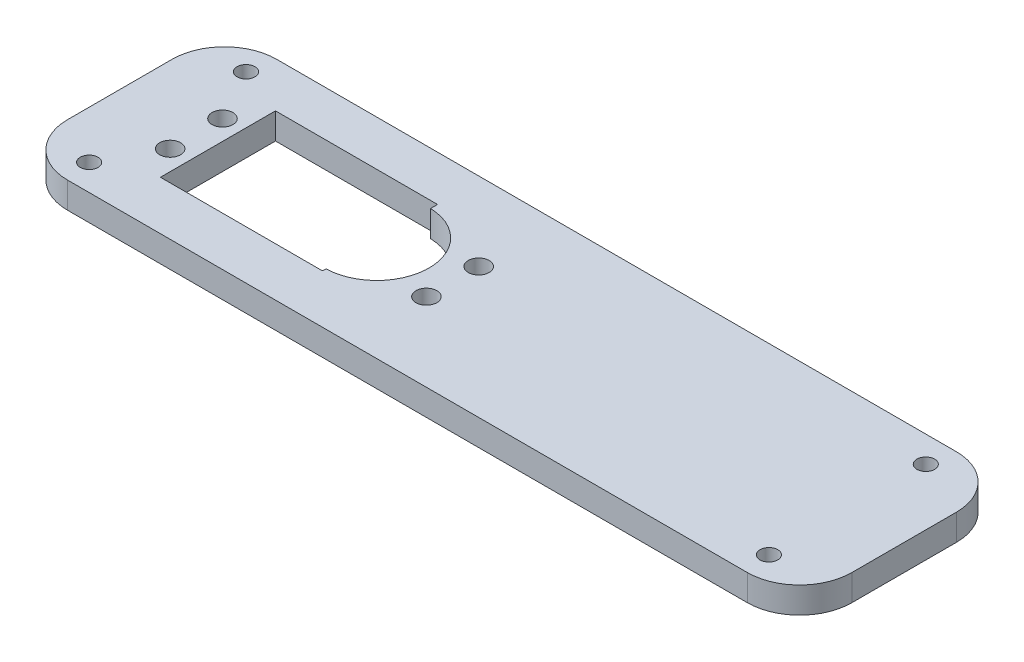
ISO-10303-21;
HEADER;
FILE_DESCRIPTION(('STEP AP214'),'2;1');
FILE_NAME('part.step','',(''),(''),'','','');
FILE_SCHEMA(('AUTOMOTIVE_DESIGN { 1 0 10303 214 1 1 1 1 }'));
ENDSEC;
DATA;
#1=APPLICATION_CONTEXT('core data for automotive mechanical design processes');
#2=APPLICATION_PROTOCOL_DEFINITION('international standard','automotive_design',2000,#1);
#3=PRODUCT_CONTEXT('',#1,'mechanical');
#4=PRODUCT('Part','Part','',(#3));
#5=PRODUCT_RELATED_PRODUCT_CATEGORY('part','',(#4));
#6=PRODUCT_DEFINITION_FORMATION('','',#4);
#7=PRODUCT_DEFINITION_CONTEXT('part definition',#1,'design');
#8=PRODUCT_DEFINITION('design','',#6,#7);
#9=PRODUCT_DEFINITION_SHAPE('','',#8);
#10=(LENGTH_UNIT() NAMED_UNIT(*) SI_UNIT(.MILLI.,.METRE.));
#11=(NAMED_UNIT(*) PLANE_ANGLE_UNIT() SI_UNIT($,.RADIAN.));
#12=(NAMED_UNIT(*) SI_UNIT($,.STERADIAN.) SOLID_ANGLE_UNIT());
#13=UNCERTAINTY_MEASURE_WITH_UNIT(LENGTH_MEASURE(1.E-05),#10,'distance_accuracy_value','');
#14=(GEOMETRIC_REPRESENTATION_CONTEXT(3) GLOBAL_UNCERTAINTY_ASSIGNED_CONTEXT((#13)) GLOBAL_UNIT_ASSIGNED_CONTEXT((#10,
#11,#12)) REPRESENTATION_CONTEXT('',''));
#15=CARTESIAN_POINT('',(0.,0.,0.));
#16=DIRECTION('',(0.,0.,1.));
#17=DIRECTION('',(1.,0.,0.));
#18=AXIS2_PLACEMENT_3D('',#15,#16,#17);
#19=CARTESIAN_POINT('',(100.867654831489,5.,-20.));
#20=DIRECTION('',(-1.,0.,0.));
#21=DIRECTION('',(0.,0.,1.));
#22=AXIS2_PLACEMENT_3D('',#19,#20,#21);
#23=PLANE('',#22);
#24=DIRECTION('',(0.,0.,-1.));
#25=VECTOR('',#24,1.);
#26=CARTESIAN_POINT('',(100.867654831489,5.,-20.));
#27=LINE('',#26,#25);
#28=CARTESIAN_POINT('',(100.867654831489,5.,9.99999999999999));
#29=VERTEX_POINT('',#28);
#30=CARTESIAN_POINT('',(100.867654831489,5.,-10.));
#31=VERTEX_POINT('',#30);
#32=EDGE_CURVE('E195',#29,#31,#27,.T.);
#33=ORIENTED_EDGE('',*,*,#32,.F.);
#34=DIRECTION('',(0.,-1.,0.));
#35=VECTOR('',#34,1.);
#36=CARTESIAN_POINT('',(100.867654831489,5.,9.99999999999999));
#37=LINE('',#36,#35);
#38=CARTESIAN_POINT('',(100.867654831489,0.,9.99999999999999));
#39=VERTEX_POINT('',#38);
#40=EDGE_CURVE('E217',#29,#39,#37,.T.);
#41=ORIENTED_EDGE('',*,*,#40,.T.);
#42=DIRECTION('',(0.,0.,-1.));
#43=VECTOR('',#42,1.);
#44=CARTESIAN_POINT('',(100.867654831489,0.,-20.));
#45=LINE('',#44,#43);
#46=CARTESIAN_POINT('',(100.867654831489,0.,-10.));
#47=VERTEX_POINT('',#46);
#48=EDGE_CURVE('E187',#39,#47,#45,.T.);
#49=ORIENTED_EDGE('',*,*,#48,.T.);
#50=DIRECTION('',(0.,-1.,0.));
#51=VECTOR('',#50,1.);
#52=CARTESIAN_POINT('',(100.867654831489,5.,-10.));
#53=LINE('',#52,#51);
#54=EDGE_CURVE('E206',#47,#31,#53,.F.);
#55=ORIENTED_EDGE('',*,*,#54,.T.);
#56=EDGE_LOOP('',(#33,#41,#49,#55));
#57=FACE_BOUND('',#56,.T.);
#58=ADVANCED_FACE('F33',(#57),#23,.F.);
#59=CARTESIAN_POINT('',(-49.1323451685113,5.,-20.));
#60=DIRECTION('',(0.,0.,1.));
#61=DIRECTION('',(1.,0.,0.));
#62=AXIS2_PLACEMENT_3D('',#59,#60,#61);
#63=PLANE('',#62);
#64=DIRECTION('',(-1.,0.,0.));
#65=VECTOR('',#64,1.);
#66=CARTESIAN_POINT('',(-49.1323451685113,0.,-20.));
#67=LINE('',#66,#65);
#68=CARTESIAN_POINT('',(90.8676548314887,0.,-20.));
#69=VERTEX_POINT('',#68);
#70=CARTESIAN_POINT('',(-39.1323451685113,0.,-20.));
#71=VERTEX_POINT('',#70);
#72=EDGE_CURVE('E209',#69,#71,#67,.T.);
#73=ORIENTED_EDGE('',*,*,#72,.T.);
#74=DIRECTION('',(0.,-1.,0.));
#75=VECTOR('',#74,1.);
#76=CARTESIAN_POINT('',(-39.1323451685113,5.,-20.));
#77=LINE('',#76,#75);
#78=CARTESIAN_POINT('',(-39.1323451685113,5.,-20.));
#79=VERTEX_POINT('',#78);
#80=EDGE_CURVE('E11',#71,#79,#77,.F.);
#81=ORIENTED_EDGE('',*,*,#80,.T.);
#82=DIRECTION('',(-1.,0.,0.));
#83=VECTOR('',#82,1.);
#84=CARTESIAN_POINT('',(-49.1323451685113,5.,-20.));
#85=LINE('',#84,#83);
#86=CARTESIAN_POINT('',(90.8676548314887,5.,-20.));
#87=VERTEX_POINT('',#86);
#88=EDGE_CURVE('E198',#87,#79,#85,.T.);
#89=ORIENTED_EDGE('',*,*,#88,.F.);
#90=DIRECTION('',(0.,-1.,0.));
#91=VECTOR('',#90,1.);
#92=CARTESIAN_POINT('',(90.8676548314887,5.,-20.));
#93=LINE('',#92,#91);
#94=EDGE_CURVE('E41',#87,#69,#93,.T.);
#95=ORIENTED_EDGE('',*,*,#94,.T.);
#96=EDGE_LOOP('',(#73,#81,#89,#95));
#97=FACE_BOUND('',#96,.T.);
#98=ADVANCED_FACE('F248',(#97),#63,.F.);
#99=CARTESIAN_POINT('',(-49.1323451685113,5.,-20.));
#100=DIRECTION('',(1.,0.,0.));
#101=DIRECTION('',(0.,0.,-1.));
#102=AXIS2_PLACEMENT_3D('',#99,#100,#101);
#103=PLANE('',#102);
#104=DIRECTION('',(0.,0.,1.));
#105=VECTOR('',#104,1.);
#106=CARTESIAN_POINT('',(-49.1323451685113,0.,-20.));
#107=LINE('',#106,#105);
#108=CARTESIAN_POINT('',(-49.1323451685113,0.,-10.));
#109=VERTEX_POINT('',#108);
#110=CARTESIAN_POINT('',(-49.1323451685113,0.,10.));
#111=VERTEX_POINT('',#110);
#112=EDGE_CURVE('E212',#109,#111,#107,.T.);
#113=ORIENTED_EDGE('',*,*,#112,.T.);
#114=DIRECTION('',(0.,-1.,0.));
#115=VECTOR('',#114,1.);
#116=CARTESIAN_POINT('',(-49.1323451685113,5.,10.));
#117=LINE('',#116,#115);
#118=CARTESIAN_POINT('',(-49.1323451685113,5.,10.));
#119=VERTEX_POINT('',#118);
#120=EDGE_CURVE('E48',#111,#119,#117,.F.);
#121=ORIENTED_EDGE('',*,*,#120,.T.);
#122=DIRECTION('',(0.,0.,1.));
#123=VECTOR('',#122,1.);
#124=CARTESIAN_POINT('',(-49.1323451685113,5.,-20.));
#125=LINE('',#124,#123);
#126=CARTESIAN_POINT('',(-49.1323451685113,5.,-10.));
#127=VERTEX_POINT('',#126);
#128=EDGE_CURVE('E201',#127,#119,#125,.T.);
#129=ORIENTED_EDGE('',*,*,#128,.F.);
#130=DIRECTION('',(0.,-1.,0.));
#131=VECTOR('',#130,1.);
#132=CARTESIAN_POINT('',(-49.1323451685113,5.,-10.));
#133=LINE('',#132,#131);
#134=EDGE_CURVE('E240',#127,#109,#133,.T.);
#135=ORIENTED_EDGE('',*,*,#134,.T.);
#136=EDGE_LOOP('',(#113,#121,#129,#135));
#137=FACE_BOUND('',#136,.T.);
#138=ADVANCED_FACE('F257',(#137),#103,.F.);
#139=CARTESIAN_POINT('',(-49.1323451685113,5.,20.));
#140=DIRECTION('',(0.,0.,-1.));
#141=DIRECTION('',(-1.,0.,0.));
#142=AXIS2_PLACEMENT_3D('',#139,#140,#141);
#143=PLANE('',#142);
#144=DIRECTION('',(1.,0.,0.));
#145=VECTOR('',#144,1.);
#146=CARTESIAN_POINT('',(-49.1323451685113,0.,20.));
#147=LINE('',#146,#145);
#148=CARTESIAN_POINT('',(-39.1323451685113,0.,20.));
#149=VERTEX_POINT('',#148);
#150=CARTESIAN_POINT('',(90.8676548314887,0.,20.));
#151=VERTEX_POINT('',#150);
#152=EDGE_CURVE('E199',#149,#151,#147,.T.);
#153=ORIENTED_EDGE('',*,*,#152,.T.);
#154=DIRECTION('',(0.,-1.,0.));
#155=VECTOR('',#154,1.);
#156=CARTESIAN_POINT('',(90.8676548314887,5.,20.));
#157=LINE('',#156,#155);
#158=CARTESIAN_POINT('',(90.8676548314887,5.,20.));
#159=VERTEX_POINT('',#158);
#160=EDGE_CURVE('E231',#151,#159,#157,.F.);
#161=ORIENTED_EDGE('',*,*,#160,.T.);
#162=DIRECTION('',(1.,0.,0.));
#163=VECTOR('',#162,1.);
#164=CARTESIAN_POINT('',(-49.1323451685113,5.,20.));
#165=LINE('',#164,#163);
#166=CARTESIAN_POINT('',(-39.1323451685113,5.,20.));
#167=VERTEX_POINT('',#166);
#168=EDGE_CURVE('E203',#167,#159,#165,.T.);
#169=ORIENTED_EDGE('',*,*,#168,.F.);
#170=DIRECTION('',(0.,-1.,0.));
#171=VECTOR('',#170,1.);
#172=CARTESIAN_POINT('',(-39.1323451685113,5.,20.));
#173=LINE('',#172,#171);
#174=EDGE_CURVE('E228',#167,#149,#173,.T.);
#175=ORIENTED_EDGE('',*,*,#174,.T.);
#176=EDGE_LOOP('',(#153,#161,#169,#175));
#177=FACE_BOUND('',#176,.T.);
#178=ADVANCED_FACE('F266',(#177),#143,.F.);
#179=CARTESIAN_POINT('',(0.,5.,0.));
#180=DIRECTION('',(0.,1.,0.));
#181=DIRECTION('',(0.,0.,1.));
#182=AXIS2_PLACEMENT_3D('',#179,#180,#181);
#183=PLANE('',#182);
#184=CARTESIAN_POINT('',(-40.,5.,15.));
#185=DIRECTION('',(0.,1.,0.));
#186=DIRECTION('',(0.,0.,1.));
#187=AXIS2_PLACEMENT_3D('',#184,#185,#186);
#188=CIRCLE('',#187,1.7);
#189=CARTESIAN_POINT('',(-40.,5.,16.7));
#190=VERTEX_POINT('',#189);
#191=EDGE_CURVE('E493',#190,#190,#188,.T.);
#192=ORIENTED_EDGE('',*,*,#191,.F.);
#193=EDGE_LOOP('',(#192));
#194=FACE_BOUND('',#193,.T.);
#195=CARTESIAN_POINT('',(90.,5.,15.));
#196=DIRECTION('',(0.,1.,0.));
#197=DIRECTION('',(0.,0.,1.));
#198=AXIS2_PLACEMENT_3D('',#195,#196,#197);
#199=CIRCLE('',#198,1.7);
#200=CARTESIAN_POINT('',(90.,5.,16.7));
#201=VERTEX_POINT('',#200);
#202=EDGE_CURVE('E497',#201,#201,#199,.T.);
#203=ORIENTED_EDGE('',*,*,#202,.F.);
#204=EDGE_LOOP('',(#203));
#205=FACE_BOUND('',#204,.T.);
#206=CARTESIAN_POINT('',(90.,5.,-15.));
#207=DIRECTION('',(0.,1.,0.));
#208=DIRECTION('',(0.,0.,1.));
#209=AXIS2_PLACEMENT_3D('',#206,#207,#208);
#210=CIRCLE('',#209,1.7);
#211=CARTESIAN_POINT('',(90.,5.,-13.3));
#212=VERTEX_POINT('',#211);
#213=EDGE_CURVE('E501',#212,#212,#210,.T.);
#214=ORIENTED_EDGE('',*,*,#213,.F.);
#215=EDGE_LOOP('',(#214));
#216=FACE_BOUND('',#215,.T.);
#217=CARTESIAN_POINT('',(-40.,5.,-15.));
#218=DIRECTION('',(0.,1.,0.));
#219=DIRECTION('',(0.,0.,1.));
#220=AXIS2_PLACEMENT_3D('',#217,#218,#219);
#221=CIRCLE('',#220,1.7);
#222=CARTESIAN_POINT('',(-40.,5.,-13.3));
#223=VERTEX_POINT('',#222);
#224=EDGE_CURVE('E505',#223,#223,#221,.T.);
#225=ORIENTED_EDGE('',*,*,#224,.F.);
#226=EDGE_LOOP('',(#225));
#227=FACE_BOUND('',#226,.T.);
#228=CARTESIAN_POINT('',(-34.5,5.,5.));
#229=DIRECTION('',(0.,1.,0.));
#230=DIRECTION('',(0.,0.,1.));
#231=AXIS2_PLACEMENT_3D('',#228,#229,#230);
#232=CIRCLE('',#231,2.);
#233=CARTESIAN_POINT('',(-34.5,5.,7.));
#234=VERTEX_POINT('',#233);
#235=EDGE_CURVE('E509',#234,#234,#232,.T.);
#236=ORIENTED_EDGE('',*,*,#235,.F.);
#237=EDGE_LOOP('',(#236));
#238=FACE_BOUND('',#237,.T.);
#239=CARTESIAN_POINT('',(-34.5,5.,-5.));
#240=DIRECTION('',(0.,1.,0.));
#241=DIRECTION('',(0.,0.,1.));
#242=AXIS2_PLACEMENT_3D('',#239,#240,#241);
#243=CIRCLE('',#242,2.);
#244=CARTESIAN_POINT('',(-34.5,5.,-2.99999999999999));
#245=VERTEX_POINT('',#244);
#246=EDGE_CURVE('E513',#245,#245,#243,.T.);
#247=ORIENTED_EDGE('',*,*,#246,.F.);
#248=EDGE_LOOP('',(#247));
#249=FACE_BOUND('',#248,.T.);
#250=CARTESIAN_POINT('',(14.5,5.,5.));
#251=DIRECTION('',(0.,1.,0.));
#252=DIRECTION('',(0.,0.,1.));
#253=AXIS2_PLACEMENT_3D('',#250,#251,#252);
#254=CIRCLE('',#253,2.);
#255=CARTESIAN_POINT('',(14.5,5.,7.));
#256=VERTEX_POINT('',#255);
#257=EDGE_CURVE('E517',#256,#256,#254,.T.);
#258=ORIENTED_EDGE('',*,*,#257,.F.);
#259=EDGE_LOOP('',(#258));
#260=FACE_BOUND('',#259,.T.);
#261=CARTESIAN_POINT('',(14.5,5.,-5.));
#262=DIRECTION('',(0.,1.,0.));
#263=DIRECTION('',(0.,0.,1.));
#264=AXIS2_PLACEMENT_3D('',#261,#262,#263);
#265=CIRCLE('',#264,2.00000000000001);
#266=CARTESIAN_POINT('',(14.5,5.,-2.99999999999998));
#267=VERTEX_POINT('',#266);
#268=EDGE_CURVE('E177',#267,#267,#265,.T.);
#269=ORIENTED_EDGE('',*,*,#268,.F.);
#270=EDGE_LOOP('',(#269));
#271=FACE_BOUND('',#270,.T.);
#272=DIRECTION('',(0.,0.,-1.));
#273=VECTOR('',#272,1.);
#274=CARTESIAN_POINT('',(0.292318991445043,5.,0.));
#275=LINE('',#274,#273);
#276=CARTESIAN_POINT('',(0.292318991445044,5.,10.6610389955653));
#277=VERTEX_POINT('',#276);
#278=CARTESIAN_POINT('',(0.292318991445044,5.,9.99572656725066));
#279=VERTEX_POINT('',#278);
#280=EDGE_CURVE('E142',#277,#279,#275,.T.);
#281=ORIENTED_EDGE('',*,*,#280,.F.);
#282=DIRECTION('',(0.999999988550517,0.,0.000151324044551329));
#283=VECTOR('',#282,1.);
#284=CARTESIAN_POINT('',(-0.00161326482765447,5.,10.6609945165469));
#285=LINE('',#284,#283);
#286=CARTESIAN_POINT('',(-30.7110104452088,5.,10.6563474463066));
#287=VERTEX_POINT('',#286);
#288=EDGE_CURVE('E161',#287,#277,#285,.T.);
#289=ORIENTED_EDGE('',*,*,#288,.F.);
#290=DIRECTION('',(-0.000151324044551416,0.,0.999999988550517));
#291=VECTOR('',#290,1.);
#292=CARTESIAN_POINT('',(-30.7093971803811,5.,-0.00464707024027768));
#293=LINE('',#292,#291);
#294=CARTESIAN_POINT('',(-30.7076810085551,5.,-11.3456855114174));
#295=VERTEX_POINT('',#294);
#296=EDGE_CURVE('E164',#295,#287,#293,.T.);
#297=ORIENTED_EDGE('',*,*,#296,.F.);
#298=DIRECTION('',(-0.999999976472949,0.,-0.000216919574991403));
#299=VECTOR('',#298,1.);
#300=CARTESIAN_POINT('',(0.00245965629886552,5.,-11.3390238805997));
#301=LINE('',#300,#299);
#302=CARTESIAN_POINT('',(0.292318991445043,5.,-11.3389610044345));
#303=VERTEX_POINT('',#302);
#304=EDGE_CURVE('E180',#303,#295,#301,.T.);
#305=ORIENTED_EDGE('',*,*,#304,.F.);
#306=CARTESIAN_POINT('',(0.292318991445043,5.,-9.99572656725066));
#307=VERTEX_POINT('',#306);
#308=EDGE_CURVE('E178',#307,#303,#275,.T.);
#309=ORIENTED_EDGE('',*,*,#308,.F.);
#310=CARTESIAN_POINT('',(0.,5.,0.));
#311=DIRECTION('',(0.,1.,0.));
#312=DIRECTION('',(0.,0.,1.));
#313=AXIS2_PLACEMENT_3D('',#310,#311,#312);
#314=CIRCLE('',#313,10.);
#315=EDGE_CURVE('E176',#279,#307,#314,.T.);
#316=ORIENTED_EDGE('',*,*,#315,.F.);
#317=EDGE_LOOP('',(#281,#289,#297,#305,#309,#316));
#318=FACE_BOUND('',#317,.T.);
#319=ORIENTED_EDGE('',*,*,#168,.T.);
#320=CARTESIAN_POINT('',(90.8676548314887,5.,9.99999999999999));
#321=DIRECTION('',(0.,1.,0.));
#322=DIRECTION('',(0.,0.,1.));
#323=AXIS2_PLACEMENT_3D('',#320,#321,#322);
#324=CIRCLE('',#323,10.);
#325=EDGE_CURVE('E238',#159,#29,#324,.T.);
#326=ORIENTED_EDGE('',*,*,#325,.T.);
#327=ORIENTED_EDGE('',*,*,#32,.T.);
#328=CARTESIAN_POINT('',(90.8676548314887,5.,-10.));
#329=DIRECTION('',(0.,1.,0.));
#330=DIRECTION('',(0.,0.,1.));
#331=AXIS2_PLACEMENT_3D('',#328,#329,#330);
#332=CIRCLE('',#331,10.);
#333=EDGE_CURVE('E233',#31,#87,#332,.T.);
#334=ORIENTED_EDGE('',*,*,#333,.T.);
#335=ORIENTED_EDGE('',*,*,#88,.T.);
#336=CARTESIAN_POINT('',(-39.1323451685113,5.,-10.));
#337=DIRECTION('',(0.,1.,0.));
#338=DIRECTION('',(0.,0.,1.));
#339=AXIS2_PLACEMENT_3D('',#336,#337,#338);
#340=CIRCLE('',#339,10.);
#341=EDGE_CURVE('E55',#79,#127,#340,.T.);
#342=ORIENTED_EDGE('',*,*,#341,.T.);
#343=ORIENTED_EDGE('',*,*,#128,.T.);
#344=CARTESIAN_POINT('',(-39.1323451685113,5.,10.));
#345=DIRECTION('',(0.,1.,0.));
#346=DIRECTION('',(0.,0.,1.));
#347=AXIS2_PLACEMENT_3D('',#344,#345,#346);
#348=CIRCLE('',#347,10.);
#349=EDGE_CURVE('E236',#119,#167,#348,.T.);
#350=ORIENTED_EDGE('',*,*,#349,.T.);
#351=EDGE_LOOP('',(#319,#326,#327,#334,#335,#342,#343,#350));
#352=FACE_BOUND('',#351,.T.);
#353=ADVANCED_FACE('F259',(#194,#205,#216,#227,#238,#249,#260,#271,#318,#352),#183,.T.);
#354=CARTESIAN_POINT('',(0.,0.,0.));
#355=DIRECTION('',(0.,1.,0.));
#356=DIRECTION('',(0.,0.,1.));
#357=AXIS2_PLACEMENT_3D('',#354,#355,#356);
#358=PLANE('',#357);
#359=CARTESIAN_POINT('',(-40.,0.,15.));
#360=DIRECTION('',(0.,1.,0.));
#361=DIRECTION('',(0.,0.,1.));
#362=AXIS2_PLACEMENT_3D('',#359,#360,#361);
#363=CIRCLE('',#362,1.7);
#364=CARTESIAN_POINT('',(-40.,0.,16.7));
#365=VERTEX_POINT('',#364);
#366=EDGE_CURVE('E554',#365,#365,#363,.T.);
#367=ORIENTED_EDGE('',*,*,#366,.T.);
#368=EDGE_LOOP('',(#367));
#369=FACE_BOUND('',#368,.T.);
#370=CARTESIAN_POINT('',(90.,0.,15.));
#371=DIRECTION('',(0.,1.,0.));
#372=DIRECTION('',(0.,0.,1.));
#373=AXIS2_PLACEMENT_3D('',#370,#371,#372);
#374=CIRCLE('',#373,1.7);
#375=CARTESIAN_POINT('',(90.,0.,16.7));
#376=VERTEX_POINT('',#375);
#377=EDGE_CURVE('E558',#376,#376,#374,.T.);
#378=ORIENTED_EDGE('',*,*,#377,.T.);
#379=EDGE_LOOP('',(#378));
#380=FACE_BOUND('',#379,.T.);
#381=CARTESIAN_POINT('',(90.,0.,-15.));
#382=DIRECTION('',(0.,1.,0.));
#383=DIRECTION('',(0.,0.,1.));
#384=AXIS2_PLACEMENT_3D('',#381,#382,#383);
#385=CIRCLE('',#384,1.7);
#386=CARTESIAN_POINT('',(90.,0.,-13.3));
#387=VERTEX_POINT('',#386);
#388=EDGE_CURVE('E551',#387,#387,#385,.T.);
#389=ORIENTED_EDGE('',*,*,#388,.T.);
#390=EDGE_LOOP('',(#389));
#391=FACE_BOUND('',#390,.T.);
#392=CARTESIAN_POINT('',(-40.,0.,-15.));
#393=DIRECTION('',(0.,1.,0.));
#394=DIRECTION('',(0.,0.,1.));
#395=AXIS2_PLACEMENT_3D('',#392,#393,#394);
#396=CIRCLE('',#395,1.7);
#397=CARTESIAN_POINT('',(-40.,0.,-13.3));
#398=VERTEX_POINT('',#397);
#399=EDGE_CURVE('E545',#398,#398,#396,.T.);
#400=ORIENTED_EDGE('',*,*,#399,.T.);
#401=EDGE_LOOP('',(#400));
#402=FACE_BOUND('',#401,.T.);
#403=CARTESIAN_POINT('',(-34.5,0.,5.));
#404=DIRECTION('',(0.,1.,0.));
#405=DIRECTION('',(0.,0.,1.));
#406=AXIS2_PLACEMENT_3D('',#403,#404,#405);
#407=CIRCLE('',#406,2.);
#408=CARTESIAN_POINT('',(-34.5,0.,7.));
#409=VERTEX_POINT('',#408);
#410=EDGE_CURVE('E543',#409,#409,#407,.T.);
#411=ORIENTED_EDGE('',*,*,#410,.T.);
#412=EDGE_LOOP('',(#411));
#413=FACE_BOUND('',#412,.T.);
#414=CARTESIAN_POINT('',(-34.5,0.,-5.));
#415=DIRECTION('',(0.,1.,0.));
#416=DIRECTION('',(0.,0.,1.));
#417=AXIS2_PLACEMENT_3D('',#414,#415,#416);
#418=CIRCLE('',#417,2.);
#419=CARTESIAN_POINT('',(-34.5,0.,-2.99999999999999));
#420=VERTEX_POINT('',#419);
#421=EDGE_CURVE('E540',#420,#420,#418,.T.);
#422=ORIENTED_EDGE('',*,*,#421,.T.);
#423=EDGE_LOOP('',(#422));
#424=FACE_BOUND('',#423,.T.);
#425=CARTESIAN_POINT('',(14.5,0.,5.));
#426=DIRECTION('',(0.,1.,0.));
#427=DIRECTION('',(0.,0.,1.));
#428=AXIS2_PLACEMENT_3D('',#425,#426,#427);
#429=CIRCLE('',#428,2.);
#430=CARTESIAN_POINT('',(14.5,0.,7.));
#431=VERTEX_POINT('',#430);
#432=EDGE_CURVE('E536',#431,#431,#429,.T.);
#433=ORIENTED_EDGE('',*,*,#432,.T.);
#434=EDGE_LOOP('',(#433));
#435=FACE_BOUND('',#434,.T.);
#436=CARTESIAN_POINT('',(14.5,0.,-5.));
#437=DIRECTION('',(0.,1.,0.));
#438=DIRECTION('',(0.,0.,1.));
#439=AXIS2_PLACEMENT_3D('',#436,#437,#438);
#440=CIRCLE('',#439,2.00000000000001);
#441=CARTESIAN_POINT('',(14.5,0.,-2.99999999999998));
#442=VERTEX_POINT('',#441);
#443=EDGE_CURVE('E528',#442,#442,#440,.T.);
#444=ORIENTED_EDGE('',*,*,#443,.T.);
#445=EDGE_LOOP('',(#444));
#446=FACE_BOUND('',#445,.T.);
#447=DIRECTION('',(0.999999988550517,0.,0.000151324044551329));
#448=VECTOR('',#447,1.);
#449=CARTESIAN_POINT('',(-0.00161326482765447,0.,10.6609945165469));
#450=LINE('',#449,#448);
#451=CARTESIAN_POINT('',(-30.7110104452088,0.,10.6563474463066));
#452=VERTEX_POINT('',#451);
#453=CARTESIAN_POINT('',(0.292318991445044,0.,10.6610389955653));
#454=VERTEX_POINT('',#453);
#455=EDGE_CURVE('E147',#452,#454,#450,.T.);
#456=ORIENTED_EDGE('',*,*,#455,.T.);
#457=DIRECTION('',(0.,0.,-1.));
#458=VECTOR('',#457,1.);
#459=CARTESIAN_POINT('',(0.292318991445043,0.,0.));
#460=LINE('',#459,#458);
#461=CARTESIAN_POINT('',(0.292318991445044,0.,9.99572656725066));
#462=VERTEX_POINT('',#461);
#463=EDGE_CURVE('E139',#454,#462,#460,.T.);
#464=ORIENTED_EDGE('',*,*,#463,.T.);
#465=CARTESIAN_POINT('',(0.,0.,0.));
#466=DIRECTION('',(0.,1.,0.));
#467=DIRECTION('',(0.,0.,1.));
#468=AXIS2_PLACEMENT_3D('',#465,#466,#467);
#469=CIRCLE('',#468,10.);
#470=CARTESIAN_POINT('',(0.292318991445043,0.,-9.99572656725066));
#471=VERTEX_POINT('',#470);
#472=EDGE_CURVE('E151',#462,#471,#469,.T.);
#473=ORIENTED_EDGE('',*,*,#472,.T.);
#474=CARTESIAN_POINT('',(0.292318991445043,0.,-11.3389610044345));
#475=VERTEX_POINT('',#474);
#476=EDGE_CURVE('E155',#471,#475,#460,.T.);
#477=ORIENTED_EDGE('',*,*,#476,.T.);
#478=DIRECTION('',(-0.999999976472949,0.,-0.000216919574991403));
#479=VECTOR('',#478,1.);
#480=CARTESIAN_POINT('',(0.00245965629886552,0.,-11.3390238805997));
#481=LINE('',#480,#479);
#482=CARTESIAN_POINT('',(-30.7076810085551,0.,-11.3456855114174));
#483=VERTEX_POINT('',#482);
#484=EDGE_CURVE('E167',#475,#483,#481,.T.);
#485=ORIENTED_EDGE('',*,*,#484,.T.);
#486=DIRECTION('',(-0.000151324044551416,0.,0.999999988550517));
#487=VECTOR('',#486,1.);
#488=CARTESIAN_POINT('',(-30.7093971803811,0.,-0.00464707024027768));
#489=LINE('',#488,#487);
#490=EDGE_CURVE('E169',#483,#452,#489,.T.);
#491=ORIENTED_EDGE('',*,*,#490,.T.);
#492=EDGE_LOOP('',(#456,#464,#473,#477,#485,#491));
#493=FACE_BOUND('',#492,.T.);
#494=ORIENTED_EDGE('',*,*,#48,.F.);
#495=CARTESIAN_POINT('',(90.8676548314887,0.,9.99999999999999));
#496=DIRECTION('',(0.,1.,0.));
#497=DIRECTION('',(0.,0.,1.));
#498=AXIS2_PLACEMENT_3D('',#495,#496,#497);
#499=CIRCLE('',#498,10.);
#500=EDGE_CURVE('E226',#39,#151,#499,.F.);
#501=ORIENTED_EDGE('',*,*,#500,.T.);
#502=ORIENTED_EDGE('',*,*,#152,.F.);
#503=CARTESIAN_POINT('',(-39.1323451685113,0.,10.));
#504=DIRECTION('',(0.,1.,0.));
#505=DIRECTION('',(0.,0.,1.));
#506=AXIS2_PLACEMENT_3D('',#503,#504,#505);
#507=CIRCLE('',#506,10.);
#508=EDGE_CURVE('E224',#149,#111,#507,.F.);
#509=ORIENTED_EDGE('',*,*,#508,.T.);
#510=ORIENTED_EDGE('',*,*,#112,.F.);
#511=CARTESIAN_POINT('',(-39.1323451685113,0.,-10.));
#512=DIRECTION('',(0.,1.,0.));
#513=DIRECTION('',(0.,0.,1.));
#514=AXIS2_PLACEMENT_3D('',#511,#512,#513);
#515=CIRCLE('',#514,10.);
#516=EDGE_CURVE('E222',#109,#71,#515,.F.);
#517=ORIENTED_EDGE('',*,*,#516,.T.);
#518=ORIENTED_EDGE('',*,*,#72,.F.);
#519=CARTESIAN_POINT('',(90.8676548314887,0.,-10.));
#520=DIRECTION('',(0.,1.,0.));
#521=DIRECTION('',(0.,0.,1.));
#522=AXIS2_PLACEMENT_3D('',#519,#520,#521);
#523=CIRCLE('',#522,10.);
#524=EDGE_CURVE('E220',#69,#47,#523,.F.);
#525=ORIENTED_EDGE('',*,*,#524,.T.);
#526=EDGE_LOOP('',(#494,#501,#502,#509,#510,#517,#518,#525));
#527=FACE_BOUND('',#526,.T.);
#528=ADVANCED_FACE('F157',(#369,#380,#391,#402,#413,#424,#435,#446,#493,#527),#358,.F.);
#529=CARTESIAN_POINT('',(0.292318991445043,0.,0.));
#530=DIRECTION('',(1.,0.,0.));
#531=DIRECTION('',(0.,0.,-1.));
#532=AXIS2_PLACEMENT_3D('',#529,#530,#531);
#533=PLANE('',#532);
#534=ORIENTED_EDGE('',*,*,#280,.T.);
#535=DIRECTION('',(0.,1.,0.));
#536=VECTOR('',#535,1.);
#537=CARTESIAN_POINT('',(0.292318991445044,0.,9.99572656725066));
#538=LINE('',#537,#536);
#539=EDGE_CURVE('E135',#462,#279,#538,.T.);
#540=ORIENTED_EDGE('',*,*,#539,.F.);
#541=ORIENTED_EDGE('',*,*,#463,.F.);
#542=DIRECTION('',(0.,1.,0.));
#543=VECTOR('',#542,1.);
#544=CARTESIAN_POINT('',(0.292318991445044,0.,10.6610389955653));
#545=LINE('',#544,#543);
#546=EDGE_CURVE('E185',#454,#277,#545,.T.);
#547=ORIENTED_EDGE('',*,*,#546,.T.);
#548=EDGE_LOOP('',(#534,#540,#541,#547));
#549=FACE_BOUND('',#548,.T.);
#550=ADVANCED_FACE('F137',(#549),#533,.F.);
#551=CARTESIAN_POINT('',(-0.00161326482765447,0.,10.6609945165469));
#552=DIRECTION('',(-0.000151324044551329,0.,0.999999988550517));
#553=DIRECTION('',(0.999999988550517,0.,0.000151324044551329));
#554=AXIS2_PLACEMENT_3D('',#551,#552,#553);
#555=PLANE('',#554);
#556=ORIENTED_EDGE('',*,*,#288,.T.);
#557=ORIENTED_EDGE('',*,*,#546,.F.);
#558=ORIENTED_EDGE('',*,*,#455,.F.);
#559=DIRECTION('',(0.,1.,0.));
#560=VECTOR('',#559,1.);
#561=CARTESIAN_POINT('',(-30.7110104452088,0.,10.6563474463066));
#562=LINE('',#561,#560);
#563=EDGE_CURVE('E188',#452,#287,#562,.T.);
#564=ORIENTED_EDGE('',*,*,#563,.T.);
#565=EDGE_LOOP('',(#556,#557,#558,#564));
#566=FACE_BOUND('',#565,.T.);
#567=ADVANCED_FACE('F417',(#566),#555,.F.);
#568=CARTESIAN_POINT('',(-30.7093971803811,0.,-0.00464707024027768));
#569=DIRECTION('',(-0.999999988550517,0.,-0.000151324044551416));
#570=DIRECTION('',(-0.000151324044551416,0.,0.999999988550517));
#571=AXIS2_PLACEMENT_3D('',#568,#569,#570);
#572=PLANE('',#571);
#573=ORIENTED_EDGE('',*,*,#296,.T.);
#574=ORIENTED_EDGE('',*,*,#563,.F.);
#575=ORIENTED_EDGE('',*,*,#490,.F.);
#576=DIRECTION('',(0.,1.,0.));
#577=VECTOR('',#576,1.);
#578=CARTESIAN_POINT('',(-30.7076810085551,0.,-11.3456855114174));
#579=LINE('',#578,#577);
#580=EDGE_CURVE('E190',#483,#295,#579,.T.);
#581=ORIENTED_EDGE('',*,*,#580,.T.);
#582=EDGE_LOOP('',(#573,#574,#575,#581));
#583=FACE_BOUND('',#582,.T.);
#584=ADVANCED_FACE('F408',(#583),#572,.F.);
#585=CARTESIAN_POINT('',(0.00245965629886552,0.,-11.3390238805997));
#586=DIRECTION('',(0.000216919574991403,0.,-0.999999976472949));
#587=DIRECTION('',(-0.999999976472949,0.,-0.000216919574991403));
#588=AXIS2_PLACEMENT_3D('',#585,#586,#587);
#589=PLANE('',#588);
#590=ORIENTED_EDGE('',*,*,#304,.T.);
#591=ORIENTED_EDGE('',*,*,#580,.F.);
#592=ORIENTED_EDGE('',*,*,#484,.F.);
#593=DIRECTION('',(0.,1.,0.));
#594=VECTOR('',#593,1.);
#595=CARTESIAN_POINT('',(0.292318991445043,0.,-11.3389610044345));
#596=LINE('',#595,#594);
#597=EDGE_CURVE('E192',#475,#303,#596,.T.);
#598=ORIENTED_EDGE('',*,*,#597,.T.);
#599=EDGE_LOOP('',(#590,#591,#592,#598));
#600=FACE_BOUND('',#599,.T.);
#601=ADVANCED_FACE('F399',(#600),#589,.F.);
#602=ORIENTED_EDGE('',*,*,#308,.T.);
#603=ORIENTED_EDGE('',*,*,#597,.F.);
#604=ORIENTED_EDGE('',*,*,#476,.F.);
#605=DIRECTION('',(0.,1.,0.));
#606=VECTOR('',#605,1.);
#607=CARTESIAN_POINT('',(0.292318991445043,0.,-9.99572656725066));
#608=LINE('',#607,#606);
#609=EDGE_CURVE('E146',#471,#307,#608,.T.);
#610=ORIENTED_EDGE('',*,*,#609,.T.);
#611=EDGE_LOOP('',(#602,#603,#604,#610));
#612=FACE_BOUND('',#611,.T.);
#613=ADVANCED_FACE('F391',(#612),#533,.F.);
#614=CARTESIAN_POINT('',(0.,0.,0.));
#615=DIRECTION('',(0.,1.,0.));
#616=DIRECTION('',(0.,0.,1.));
#617=AXIS2_PLACEMENT_3D('',#614,#615,#616);
#618=CYLINDRICAL_SURFACE('',#617,10.);
#619=ORIENTED_EDGE('',*,*,#315,.T.);
#620=ORIENTED_EDGE('',*,*,#609,.F.);
#621=ORIENTED_EDGE('',*,*,#472,.F.);
#622=ORIENTED_EDGE('',*,*,#539,.T.);
#623=EDGE_LOOP('',(#619,#620,#621,#622));
#624=FACE_BOUND('',#623,.T.);
#625=ADVANCED_FACE('F152',(#624),#618,.F.);
#626=CARTESIAN_POINT('',(14.5,0.,-5.));
#627=DIRECTION('',(0.,1.,0.));
#628=DIRECTION('',(0.,0.,1.));
#629=AXIS2_PLACEMENT_3D('',#626,#627,#628);
#630=CYLINDRICAL_SURFACE('',#629,2.00000000000001);
#631=ORIENTED_EDGE('',*,*,#443,.F.);
#632=EDGE_LOOP('',(#631));
#633=FACE_BOUND('',#632,.T.);
#634=ORIENTED_EDGE('',*,*,#268,.T.);
#635=EDGE_LOOP('',(#634));
#636=FACE_BOUND('',#635,.T.);
#637=ADVANCED_FACE('F374',(#633,#636),#630,.F.);
#638=CARTESIAN_POINT('',(14.5,0.,5.));
#639=DIRECTION('',(0.,1.,0.));
#640=DIRECTION('',(0.,0.,1.));
#641=AXIS2_PLACEMENT_3D('',#638,#639,#640);
#642=CYLINDRICAL_SURFACE('',#641,2.);
#643=ORIENTED_EDGE('',*,*,#432,.F.);
#644=EDGE_LOOP('',(#643));
#645=FACE_BOUND('',#644,.T.);
#646=ORIENTED_EDGE('',*,*,#257,.T.);
#647=EDGE_LOOP('',(#646));
#648=FACE_BOUND('',#647,.T.);
#649=ADVANCED_FACE('F365',(#645,#648),#642,.F.);
#650=CARTESIAN_POINT('',(-34.5,0.,-5.));
#651=DIRECTION('',(0.,1.,0.));
#652=DIRECTION('',(0.,0.,1.));
#653=AXIS2_PLACEMENT_3D('',#650,#651,#652);
#654=CYLINDRICAL_SURFACE('',#653,2.);
#655=ORIENTED_EDGE('',*,*,#421,.F.);
#656=EDGE_LOOP('',(#655));
#657=FACE_BOUND('',#656,.T.);
#658=ORIENTED_EDGE('',*,*,#246,.T.);
#659=EDGE_LOOP('',(#658));
#660=FACE_BOUND('',#659,.T.);
#661=ADVANCED_FACE('F356',(#657,#660),#654,.F.);
#662=CARTESIAN_POINT('',(-34.5,0.,5.));
#663=DIRECTION('',(0.,1.,0.));
#664=DIRECTION('',(0.,0.,1.));
#665=AXIS2_PLACEMENT_3D('',#662,#663,#664);
#666=CYLINDRICAL_SURFACE('',#665,2.);
#667=ORIENTED_EDGE('',*,*,#410,.F.);
#668=EDGE_LOOP('',(#667));
#669=FACE_BOUND('',#668,.T.);
#670=ORIENTED_EDGE('',*,*,#235,.T.);
#671=EDGE_LOOP('',(#670));
#672=FACE_BOUND('',#671,.T.);
#673=ADVANCED_FACE('F347',(#669,#672),#666,.F.);
#674=CARTESIAN_POINT('',(-40.,0.,-15.));
#675=DIRECTION('',(0.,1.,0.));
#676=DIRECTION('',(0.,0.,1.));
#677=AXIS2_PLACEMENT_3D('',#674,#675,#676);
#678=CYLINDRICAL_SURFACE('',#677,1.7);
#679=ORIENTED_EDGE('',*,*,#399,.F.);
#680=EDGE_LOOP('',(#679));
#681=FACE_BOUND('',#680,.T.);
#682=ORIENTED_EDGE('',*,*,#224,.T.);
#683=EDGE_LOOP('',(#682));
#684=FACE_BOUND('',#683,.T.);
#685=ADVANCED_FACE('F338',(#681,#684),#678,.F.);
#686=CARTESIAN_POINT('',(90.,0.,-15.));
#687=DIRECTION('',(0.,1.,0.));
#688=DIRECTION('',(0.,0.,1.));
#689=AXIS2_PLACEMENT_3D('',#686,#687,#688);
#690=CYLINDRICAL_SURFACE('',#689,1.7);
#691=ORIENTED_EDGE('',*,*,#388,.F.);
#692=EDGE_LOOP('',(#691));
#693=FACE_BOUND('',#692,.T.);
#694=ORIENTED_EDGE('',*,*,#213,.T.);
#695=EDGE_LOOP('',(#694));
#696=FACE_BOUND('',#695,.T.);
#697=ADVANCED_FACE('F329',(#693,#696),#690,.F.);
#698=CARTESIAN_POINT('',(90.,0.,15.));
#699=DIRECTION('',(0.,1.,0.));
#700=DIRECTION('',(0.,0.,1.));
#701=AXIS2_PLACEMENT_3D('',#698,#699,#700);
#702=CYLINDRICAL_SURFACE('',#701,1.7);
#703=ORIENTED_EDGE('',*,*,#377,.F.);
#704=EDGE_LOOP('',(#703));
#705=FACE_BOUND('',#704,.T.);
#706=ORIENTED_EDGE('',*,*,#202,.T.);
#707=EDGE_LOOP('',(#706));
#708=FACE_BOUND('',#707,.T.);
#709=ADVANCED_FACE('F320',(#705,#708),#702,.F.);
#710=CARTESIAN_POINT('',(-40.,0.,15.));
#711=DIRECTION('',(0.,1.,0.));
#712=DIRECTION('',(0.,0.,1.));
#713=AXIS2_PLACEMENT_3D('',#710,#711,#712);
#714=CYLINDRICAL_SURFACE('',#713,1.7);
#715=ORIENTED_EDGE('',*,*,#366,.F.);
#716=EDGE_LOOP('',(#715));
#717=FACE_BOUND('',#716,.T.);
#718=ORIENTED_EDGE('',*,*,#191,.T.);
#719=EDGE_LOOP('',(#718));
#720=FACE_BOUND('',#719,.T.);
#721=ADVANCED_FACE('F289',(#717,#720),#714,.F.);
#722=CARTESIAN_POINT('',(90.8676548314887,5.,9.99999999999999));
#723=DIRECTION('',(0.,-1.,0.));
#724=DIRECTION('',(0.,0.,-1.));
#725=AXIS2_PLACEMENT_3D('',#722,#723,#724);
#726=CYLINDRICAL_SURFACE('',#725,10.);
#727=ORIENTED_EDGE('',*,*,#325,.F.);
#728=ORIENTED_EDGE('',*,*,#160,.F.);
#729=ORIENTED_EDGE('',*,*,#500,.F.);
#730=ORIENTED_EDGE('',*,*,#40,.F.);
#731=EDGE_LOOP('',(#727,#728,#729,#730));
#732=FACE_BOUND('',#731,.T.);
#733=ADVANCED_FACE('F271',(#732),#726,.T.);
#734=CARTESIAN_POINT('',(-39.1323451685113,5.,10.));
#735=DIRECTION('',(0.,-1.,0.));
#736=DIRECTION('',(0.,0.,-1.));
#737=AXIS2_PLACEMENT_3D('',#734,#735,#736);
#738=CYLINDRICAL_SURFACE('',#737,10.);
#739=ORIENTED_EDGE('',*,*,#349,.F.);
#740=ORIENTED_EDGE('',*,*,#120,.F.);
#741=ORIENTED_EDGE('',*,*,#508,.F.);
#742=ORIENTED_EDGE('',*,*,#174,.F.);
#743=EDGE_LOOP('',(#739,#740,#741,#742));
#744=FACE_BOUND('',#743,.T.);
#745=ADVANCED_FACE('F263',(#744),#738,.T.);
#746=CARTESIAN_POINT('',(-39.1323451685113,5.,-10.));
#747=DIRECTION('',(0.,-1.,0.));
#748=DIRECTION('',(0.,0.,-1.));
#749=AXIS2_PLACEMENT_3D('',#746,#747,#748);
#750=CYLINDRICAL_SURFACE('',#749,10.);
#751=ORIENTED_EDGE('',*,*,#341,.F.);
#752=ORIENTED_EDGE('',*,*,#80,.F.);
#753=ORIENTED_EDGE('',*,*,#516,.F.);
#754=ORIENTED_EDGE('',*,*,#134,.F.);
#755=EDGE_LOOP('',(#751,#752,#753,#754));
#756=FACE_BOUND('',#755,.T.);
#757=ADVANCED_FACE('F256',(#756),#750,.T.);
#758=CARTESIAN_POINT('',(90.8676548314887,5.,-10.));
#759=DIRECTION('',(0.,-1.,0.));
#760=DIRECTION('',(0.,0.,-1.));
#761=AXIS2_PLACEMENT_3D('',#758,#759,#760);
#762=CYLINDRICAL_SURFACE('',#761,10.);
#763=ORIENTED_EDGE('',*,*,#333,.F.);
#764=ORIENTED_EDGE('',*,*,#54,.F.);
#765=ORIENTED_EDGE('',*,*,#524,.F.);
#766=ORIENTED_EDGE('',*,*,#94,.F.);
#767=EDGE_LOOP('',(#763,#764,#765,#766));
#768=FACE_BOUND('',#767,.T.);
#769=ADVANCED_FACE('F35',(#768),#762,.T.);
#770=CLOSED_SHELL('',(#58,#98,#138,#178,#353,#528,#550,#567,#584,#601,#613,#625,#637,#649,#661,
#673,#685,#697,#709,#721,#733,#745,#757,#769));
#771=MANIFOLD_SOLID_BREP('B2',#770);
#772=ADVANCED_BREP_SHAPE_REPRESENTATION('',(#18,#771),#14);
#773=SHAPE_DEFINITION_REPRESENTATION(#9,#772);
ENDSEC;
END-ISO-10303-21;
